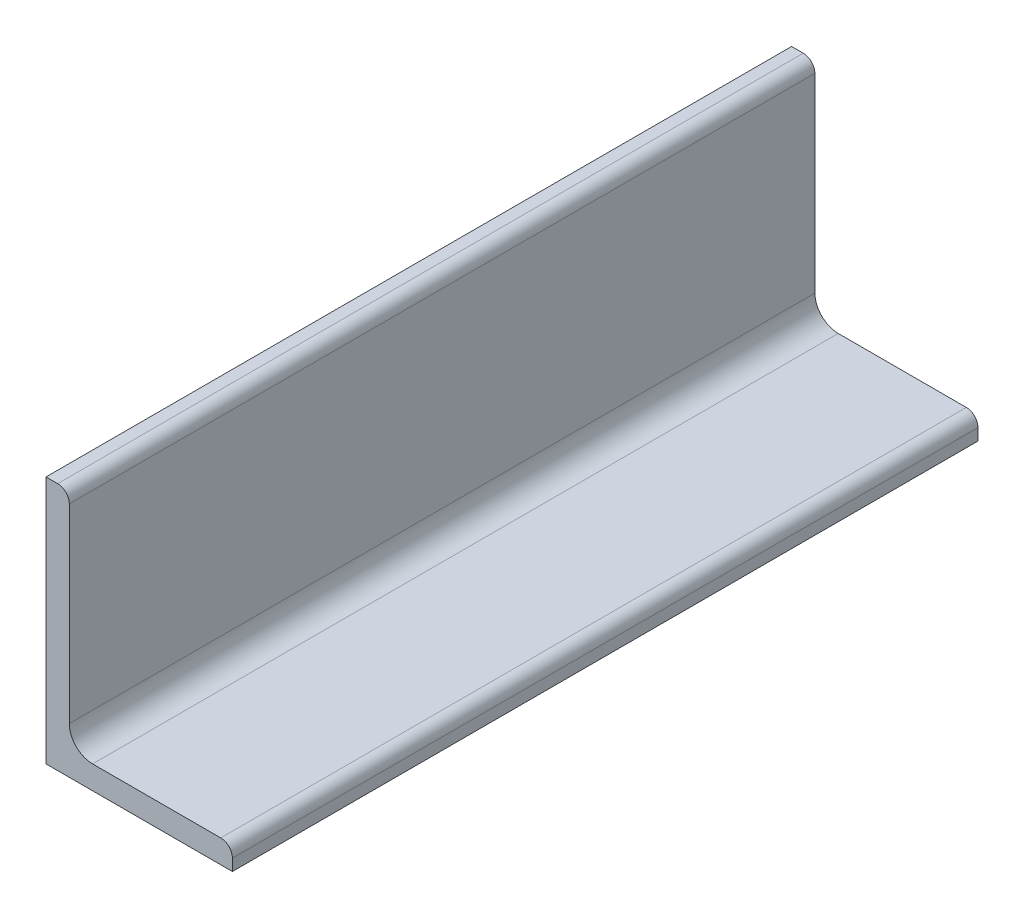
ISO-10303-21;
HEADER;
FILE_DESCRIPTION(('STEP AP214'),'2;1');
FILE_NAME('part.step','',(''),(''),'','','');
FILE_SCHEMA(('AUTOMOTIVE_DESIGN { 1 0 10303 214 1 1 1 1 }'));
ENDSEC;
DATA;
#1=APPLICATION_CONTEXT('core data for automotive mechanical design processes');
#2=APPLICATION_PROTOCOL_DEFINITION('international standard','automotive_design',2000,#1);
#3=PRODUCT_CONTEXT('',#1,'mechanical');
#4=PRODUCT('Part','Part','',(#3));
#5=PRODUCT_RELATED_PRODUCT_CATEGORY('part','',(#4));
#6=PRODUCT_DEFINITION_FORMATION('','',#4);
#7=PRODUCT_DEFINITION_CONTEXT('part definition',#1,'design');
#8=PRODUCT_DEFINITION('design','',#6,#7);
#9=PRODUCT_DEFINITION_SHAPE('','',#8);
#10=(LENGTH_UNIT() NAMED_UNIT(*) SI_UNIT(.MILLI.,.METRE.));
#11=(NAMED_UNIT(*) PLANE_ANGLE_UNIT() SI_UNIT($,.RADIAN.));
#12=(NAMED_UNIT(*) SI_UNIT($,.STERADIAN.) SOLID_ANGLE_UNIT());
#13=UNCERTAINTY_MEASURE_WITH_UNIT(LENGTH_MEASURE(1.E-05),#10,'distance_accuracy_value','');
#14=(GEOMETRIC_REPRESENTATION_CONTEXT(3) GLOBAL_UNCERTAINTY_ASSIGNED_CONTEXT((#13)) GLOBAL_UNIT_ASSIGNED_CONTEXT((#10,
#11,#12)) REPRESENTATION_CONTEXT('',''));
#15=CARTESIAN_POINT('',(0.,0.,0.));
#16=DIRECTION('',(0.,0.,1.));
#17=DIRECTION('',(1.,0.,0.));
#18=AXIS2_PLACEMENT_3D('',#15,#16,#17);
#19=CARTESIAN_POINT('',(0.490776827053332,102.172018782971,304.8));
#20=DIRECTION('',(1.,0.,0.));
#21=DIRECTION('',(0.,0.,-1.));
#22=AXIS2_PLACEMENT_3D('',#19,#20,#21);
#23=PLANE('',#22);
#24=DIRECTION('',(0.,-1.,0.));
#25=VECTOR('',#24,1.);
#26=CARTESIAN_POINT('',(0.490776827053332,102.172018782971,0.));
#27=LINE('',#26,#25);
#28=CARTESIAN_POINT('',(0.490776827053332,102.172018782971,0.));
#29=VERTEX_POINT('',#28);
#30=CARTESIAN_POINT('',(0.490776827053332,0.572018782971054,0.));
#31=VERTEX_POINT('',#30);
#32=EDGE_CURVE('E135',#29,#31,#27,.T.);
#33=ORIENTED_EDGE('',*,*,#32,.T.);
#34=DIRECTION('',(0.,0.,-1.));
#35=VECTOR('',#34,1.);
#36=CARTESIAN_POINT('',(0.490776827053332,0.572018782971054,304.8));
#37=LINE('',#36,#35);
#38=CARTESIAN_POINT('',(0.490776827053332,0.572018782971054,304.8));
#39=VERTEX_POINT('',#38);
#40=EDGE_CURVE('E11',#39,#31,#37,.T.);
#41=ORIENTED_EDGE('',*,*,#40,.F.);
#42=DIRECTION('',(0.,-1.,0.));
#43=VECTOR('',#42,1.);
#44=CARTESIAN_POINT('',(0.490776827053332,102.172018782971,304.8));
#45=LINE('',#44,#43);
#46=CARTESIAN_POINT('',(0.490776827053332,102.172018782971,304.8));
#47=VERTEX_POINT('',#46);
#48=EDGE_CURVE('E151',#47,#39,#45,.T.);
#49=ORIENTED_EDGE('',*,*,#48,.F.);
#50=DIRECTION('',(0.,0.,-1.));
#51=VECTOR('',#50,1.);
#52=CARTESIAN_POINT('',(0.490776827053332,102.172018782971,304.8));
#53=LINE('',#52,#51);
#54=EDGE_CURVE('E131',#47,#29,#53,.T.);
#55=ORIENTED_EDGE('',*,*,#54,.T.);
#56=EDGE_LOOP('',(#33,#41,#49,#55));
#57=FACE_BOUND('',#56,.T.);
#58=ADVANCED_FACE('F33',(#57),#23,.F.);
#59=CARTESIAN_POINT('',(0.490776827053332,0.572018782971054,304.8));
#60=DIRECTION('',(0.,1.,0.));
#61=DIRECTION('',(0.,0.,1.));
#62=AXIS2_PLACEMENT_3D('',#59,#60,#61);
#63=PLANE('',#62);
#64=DIRECTION('',(1.,0.,0.));
#65=VECTOR('',#64,1.);
#66=CARTESIAN_POINT('',(0.490776827053332,0.572018782971054,0.));
#67=LINE('',#66,#65);
#68=CARTESIAN_POINT('',(76.6907768270533,0.572018782971054,0.));
#69=VERTEX_POINT('',#68);
#70=EDGE_CURVE('E138',#31,#69,#67,.T.);
#71=ORIENTED_EDGE('',*,*,#70,.T.);
#72=DIRECTION('',(0.,0.,-1.));
#73=VECTOR('',#72,1.);
#74=CARTESIAN_POINT('',(76.6907768270533,0.572018782971054,304.8));
#75=LINE('',#74,#73);
#76=CARTESIAN_POINT('',(76.6907768270533,0.572018782971054,304.8));
#77=VERTEX_POINT('',#76);
#78=EDGE_CURVE('E41',#77,#69,#75,.T.);
#79=ORIENTED_EDGE('',*,*,#78,.F.);
#80=DIRECTION('',(1.,0.,0.));
#81=VECTOR('',#80,1.);
#82=CARTESIAN_POINT('',(0.490776827053332,0.572018782971054,304.8));
#83=LINE('',#82,#81);
#84=EDGE_CURVE('E95',#39,#77,#83,.T.);
#85=ORIENTED_EDGE('',*,*,#84,.F.);
#86=ORIENTED_EDGE('',*,*,#40,.T.);
#87=EDGE_LOOP('',(#71,#79,#85,#86));
#88=FACE_BOUND('',#87,.T.);
#89=ADVANCED_FACE('F194',(#88),#63,.F.);
#90=CARTESIAN_POINT('',(76.6907768270533,0.572018782971054,304.8));
#91=DIRECTION('',(-1.,0.,0.));
#92=DIRECTION('',(0.,0.,1.));
#93=AXIS2_PLACEMENT_3D('',#90,#91,#92);
#94=PLANE('',#93);
#95=DIRECTION('',(0.,1.,0.));
#96=VECTOR('',#95,1.);
#97=CARTESIAN_POINT('',(76.6907768270533,0.572018782971054,0.));
#98=LINE('',#97,#96);
#99=CARTESIAN_POINT('',(76.6907768270533,5.33451878297105,0.));
#100=VERTEX_POINT('',#99);
#101=EDGE_CURVE('E140',#69,#100,#98,.T.);
#102=ORIENTED_EDGE('',*,*,#101,.T.);
#103=DIRECTION('',(0.,0.,-1.));
#104=VECTOR('',#103,1.);
#105=CARTESIAN_POINT('',(76.6907768270533,5.33451878297105,304.8));
#106=LINE('',#105,#104);
#107=CARTESIAN_POINT('',(76.6907768270533,5.33451878297105,304.8));
#108=VERTEX_POINT('',#107);
#109=EDGE_CURVE('E161',#108,#100,#106,.T.);
#110=ORIENTED_EDGE('',*,*,#109,.F.);
#111=DIRECTION('',(0.,1.,0.));
#112=VECTOR('',#111,1.);
#113=CARTESIAN_POINT('',(76.6907768270533,0.572018782971054,304.8));
#114=LINE('',#113,#112);
#115=EDGE_CURVE('E169',#77,#108,#114,.T.);
#116=ORIENTED_EDGE('',*,*,#115,.F.);
#117=ORIENTED_EDGE('',*,*,#78,.T.);
#118=EDGE_LOOP('',(#102,#110,#116,#117));
#119=FACE_BOUND('',#118,.T.);
#120=ADVANCED_FACE('F167',(#119),#94,.F.);
#121=CARTESIAN_POINT('',(71.9282768270533,5.33451878297105,304.8));
#122=DIRECTION('',(0.,0.,-1.));
#123=DIRECTION('',(-1.,0.,0.));
#124=AXIS2_PLACEMENT_3D('',#121,#122,#123);
#125=CYLINDRICAL_SURFACE('',#124,4.7625);
#126=CARTESIAN_POINT('',(71.9282768270533,5.33451878297105,0.));
#127=DIRECTION('',(0.,0.,1.));
#128=DIRECTION('',(1.,0.,0.));
#129=AXIS2_PLACEMENT_3D('',#126,#127,#128);
#130=CIRCLE('',#129,4.7625);
#131=CARTESIAN_POINT('',(71.9282768270533,10.0970187829711,0.));
#132=VERTEX_POINT('',#131);
#133=EDGE_CURVE('E142',#100,#132,#130,.T.);
#134=ORIENTED_EDGE('',*,*,#133,.T.);
#135=DIRECTION('',(0.,0.,-1.));
#136=VECTOR('',#135,1.);
#137=CARTESIAN_POINT('',(71.9282768270533,10.0970187829711,304.8));
#138=LINE('',#137,#136);
#139=CARTESIAN_POINT('',(71.9282768270533,10.0970187829711,304.8));
#140=VERTEX_POINT('',#139);
#141=EDGE_CURVE('E158',#140,#132,#138,.T.);
#142=ORIENTED_EDGE('',*,*,#141,.F.);
#143=CARTESIAN_POINT('',(71.9282768270533,5.33451878297105,304.8));
#144=DIRECTION('',(0.,0.,1.));
#145=DIRECTION('',(1.,0.,0.));
#146=AXIS2_PLACEMENT_3D('',#143,#144,#145);
#147=CIRCLE('',#146,4.7625);
#148=EDGE_CURVE('E185',#108,#140,#147,.T.);
#149=ORIENTED_EDGE('',*,*,#148,.F.);
#150=ORIENTED_EDGE('',*,*,#109,.T.);
#151=EDGE_LOOP('',(#134,#142,#149,#150));
#152=FACE_BOUND('',#151,.T.);
#153=ADVANCED_FACE('F178',(#152),#125,.T.);
#154=CARTESIAN_POINT('',(71.9282768270533,10.0970187829711,304.8));
#155=DIRECTION('',(0.,-1.,0.));
#156=DIRECTION('',(0.,0.,-1.));
#157=AXIS2_PLACEMENT_3D('',#154,#155,#156);
#158=PLANE('',#157);
#159=DIRECTION('',(-1.,0.,0.));
#160=VECTOR('',#159,1.);
#161=CARTESIAN_POINT('',(71.9282768270533,10.0970187829711,0.));
#162=LINE('',#161,#160);
#163=CARTESIAN_POINT('',(19.5407768270533,10.0970187829711,0.));
#164=VERTEX_POINT('',#163);
#165=EDGE_CURVE('E144',#132,#164,#162,.T.);
#166=ORIENTED_EDGE('',*,*,#165,.T.);
#167=DIRECTION('',(0.,0.,-1.));
#168=VECTOR('',#167,1.);
#169=CARTESIAN_POINT('',(19.5407768270533,10.0970187829711,304.8));
#170=LINE('',#169,#168);
#171=CARTESIAN_POINT('',(19.5407768270533,10.0970187829711,304.8));
#172=VERTEX_POINT('',#171);
#173=EDGE_CURVE('E155',#172,#164,#170,.T.);
#174=ORIENTED_EDGE('',*,*,#173,.F.);
#175=DIRECTION('',(-1.,0.,0.));
#176=VECTOR('',#175,1.);
#177=CARTESIAN_POINT('',(71.9282768270533,10.0970187829711,304.8));
#178=LINE('',#177,#176);
#179=EDGE_CURVE('E184',#140,#172,#178,.T.);
#180=ORIENTED_EDGE('',*,*,#179,.F.);
#181=ORIENTED_EDGE('',*,*,#141,.T.);
#182=EDGE_LOOP('',(#166,#174,#180,#181));
#183=FACE_BOUND('',#182,.T.);
#184=ADVANCED_FACE('F182',(#183),#158,.F.);
#185=CARTESIAN_POINT('',(19.5407768270533,19.622018782971,304.8));
#186=DIRECTION('',(0.,0.,-1.));
#187=DIRECTION('',(-1.,0.,0.));
#188=AXIS2_PLACEMENT_3D('',#185,#186,#187);
#189=CYLINDRICAL_SURFACE('',#188,9.52499999999999);
#190=CARTESIAN_POINT('',(19.5407768270533,19.622018782971,0.));
#191=DIRECTION('',(0.,0.,-1.));
#192=DIRECTION('',(1.,0.,0.));
#193=AXIS2_PLACEMENT_3D('',#190,#191,#192);
#194=CIRCLE('',#193,9.52499999999999);
#195=CARTESIAN_POINT('',(10.0157768270533,19.6220187829711,0.));
#196=VERTEX_POINT('',#195);
#197=EDGE_CURVE('E146',#164,#196,#194,.T.);
#198=ORIENTED_EDGE('',*,*,#197,.T.);
#199=DIRECTION('',(0.,0.,-1.));
#200=VECTOR('',#199,1.);
#201=CARTESIAN_POINT('',(10.0157768270533,19.6220187829711,304.8));
#202=LINE('',#201,#200);
#203=CARTESIAN_POINT('',(10.0157768270533,19.6220187829711,304.8));
#204=VERTEX_POINT('',#203);
#205=EDGE_CURVE('E126',#204,#196,#202,.T.);
#206=ORIENTED_EDGE('',*,*,#205,.F.);
#207=CARTESIAN_POINT('',(19.5407768270533,19.622018782971,304.8));
#208=DIRECTION('',(0.,0.,-1.));
#209=DIRECTION('',(1.,0.,0.));
#210=AXIS2_PLACEMENT_3D('',#207,#208,#209);
#211=CIRCLE('',#210,9.52499999999999);
#212=EDGE_CURVE('E117',#172,#204,#211,.T.);
#213=ORIENTED_EDGE('',*,*,#212,.F.);
#214=ORIENTED_EDGE('',*,*,#173,.T.);
#215=EDGE_LOOP('',(#198,#206,#213,#214));
#216=FACE_BOUND('',#215,.T.);
#217=ADVANCED_FACE('F206',(#216),#189,.F.);
#218=CARTESIAN_POINT('',(10.0157768270533,19.6220187829711,304.8));
#219=DIRECTION('',(-1.,0.,0.));
#220=DIRECTION('',(0.,0.,1.));
#221=AXIS2_PLACEMENT_3D('',#218,#219,#220);
#222=PLANE('',#221);
#223=DIRECTION('',(0.,1.,0.));
#224=VECTOR('',#223,1.);
#225=CARTESIAN_POINT('',(10.0157768270533,19.6220187829711,0.));
#226=LINE('',#225,#224);
#227=CARTESIAN_POINT('',(10.0157768270533,97.409518782971,0.));
#228=VERTEX_POINT('',#227);
#229=EDGE_CURVE('E125',#196,#228,#226,.T.);
#230=ORIENTED_EDGE('',*,*,#229,.T.);
#231=DIRECTION('',(0.,0.,-1.));
#232=VECTOR('',#231,1.);
#233=CARTESIAN_POINT('',(10.0157768270533,97.409518782971,304.8));
#234=LINE('',#233,#232);
#235=CARTESIAN_POINT('',(10.0157768270533,97.409518782971,304.8));
#236=VERTEX_POINT('',#235);
#237=EDGE_CURVE('E122',#236,#228,#234,.T.);
#238=ORIENTED_EDGE('',*,*,#237,.F.);
#239=DIRECTION('',(0.,1.,0.));
#240=VECTOR('',#239,1.);
#241=CARTESIAN_POINT('',(10.0157768270533,19.6220187829711,304.8));
#242=LINE('',#241,#240);
#243=EDGE_CURVE('E111',#204,#236,#242,.T.);
#244=ORIENTED_EDGE('',*,*,#243,.F.);
#245=ORIENTED_EDGE('',*,*,#205,.T.);
#246=EDGE_LOOP('',(#230,#238,#244,#245));
#247=FACE_BOUND('',#246,.T.);
#248=ADVANCED_FACE('F123',(#247),#222,.F.);
#249=CARTESIAN_POINT('',(5.25327682705333,97.409518782971,304.8));
#250=DIRECTION('',(0.,0.,-1.));
#251=DIRECTION('',(-1.,0.,0.));
#252=AXIS2_PLACEMENT_3D('',#249,#250,#251);
#253=CYLINDRICAL_SURFACE('',#252,4.7625);
#254=CARTESIAN_POINT('',(5.25327682705333,97.409518782971,0.));
#255=DIRECTION('',(0.,0.,1.));
#256=DIRECTION('',(1.,0.,0.));
#257=AXIS2_PLACEMENT_3D('',#254,#255,#256);
#258=CIRCLE('',#257,4.7625);
#259=CARTESIAN_POINT('',(5.25327682705333,102.172018782971,0.));
#260=VERTEX_POINT('',#259);
#261=EDGE_CURVE('E81',#228,#260,#258,.T.);
#262=ORIENTED_EDGE('',*,*,#261,.T.);
#263=DIRECTION('',(0.,0.,-1.));
#264=VECTOR('',#263,1.);
#265=CARTESIAN_POINT('',(5.25327682705333,102.172018782971,304.8));
#266=LINE('',#265,#264);
#267=CARTESIAN_POINT('',(5.25327682705333,102.172018782971,304.8));
#268=VERTEX_POINT('',#267);
#269=EDGE_CURVE('E127',#268,#260,#266,.T.);
#270=ORIENTED_EDGE('',*,*,#269,.F.);
#271=CARTESIAN_POINT('',(5.25327682705333,97.409518782971,304.8));
#272=DIRECTION('',(0.,0.,1.));
#273=DIRECTION('',(1.,0.,0.));
#274=AXIS2_PLACEMENT_3D('',#271,#272,#273);
#275=CIRCLE('',#274,4.7625);
#276=EDGE_CURVE('E115',#236,#268,#275,.T.);
#277=ORIENTED_EDGE('',*,*,#276,.F.);
#278=ORIENTED_EDGE('',*,*,#237,.T.);
#279=EDGE_LOOP('',(#262,#270,#277,#278));
#280=FACE_BOUND('',#279,.T.);
#281=ADVANCED_FACE('F129',(#280),#253,.T.);
#282=CARTESIAN_POINT('',(5.25327682705333,102.172018782971,304.8));
#283=DIRECTION('',(0.,-1.,0.));
#284=DIRECTION('',(0.,0.,-1.));
#285=AXIS2_PLACEMENT_3D('',#282,#283,#284);
#286=PLANE('',#285);
#287=DIRECTION('',(-1.,0.,0.));
#288=VECTOR('',#287,1.);
#289=CARTESIAN_POINT('',(5.25327682705333,102.172018782971,0.));
#290=LINE('',#289,#288);
#291=EDGE_CURVE('E87',#260,#29,#290,.T.);
#292=ORIENTED_EDGE('',*,*,#291,.T.);
#293=ORIENTED_EDGE('',*,*,#54,.F.);
#294=DIRECTION('',(-1.,0.,0.));
#295=VECTOR('',#294,1.);
#296=CARTESIAN_POINT('',(5.25327682705333,102.172018782971,304.8));
#297=LINE('',#296,#295);
#298=EDGE_CURVE('E49',#268,#47,#297,.T.);
#299=ORIENTED_EDGE('',*,*,#298,.F.);
#300=ORIENTED_EDGE('',*,*,#269,.T.);
#301=EDGE_LOOP('',(#292,#293,#299,#300));
#302=FACE_BOUND('',#301,.T.);
#303=ADVANCED_FACE('F214',(#302),#286,.F.);
#304=CARTESIAN_POINT('',(71.9282768270533,5.33451878297105,304.8));
#305=DIRECTION('',(0.,0.,1.));
#306=DIRECTION('',(1.,0.,0.));
#307=AXIS2_PLACEMENT_3D('',#304,#305,#306);
#308=PLANE('',#307);
#309=ORIENTED_EDGE('',*,*,#48,.T.);
#310=ORIENTED_EDGE('',*,*,#84,.T.);
#311=ORIENTED_EDGE('',*,*,#115,.T.);
#312=ORIENTED_EDGE('',*,*,#148,.T.);
#313=ORIENTED_EDGE('',*,*,#179,.T.);
#314=ORIENTED_EDGE('',*,*,#212,.T.);
#315=ORIENTED_EDGE('',*,*,#243,.T.);
#316=ORIENTED_EDGE('',*,*,#276,.T.);
#317=ORIENTED_EDGE('',*,*,#298,.T.);
#318=EDGE_LOOP('',(#309,#310,#311,#312,#313,#314,#315,#316,#317));
#319=FACE_BOUND('',#318,.T.);
#320=ADVANCED_FACE('F113',(#319),#308,.T.);
#321=CARTESIAN_POINT('',(71.9282768270533,5.33451878297105,0.));
#322=DIRECTION('',(0.,0.,1.));
#323=DIRECTION('',(1.,0.,0.));
#324=AXIS2_PLACEMENT_3D('',#321,#322,#323);
#325=PLANE('',#324);
#326=ORIENTED_EDGE('',*,*,#32,.F.);
#327=ORIENTED_EDGE('',*,*,#291,.F.);
#328=ORIENTED_EDGE('',*,*,#261,.F.);
#329=ORIENTED_EDGE('',*,*,#229,.F.);
#330=ORIENTED_EDGE('',*,*,#197,.F.);
#331=ORIENTED_EDGE('',*,*,#165,.F.);
#332=ORIENTED_EDGE('',*,*,#133,.F.);
#333=ORIENTED_EDGE('',*,*,#101,.F.);
#334=ORIENTED_EDGE('',*,*,#70,.F.);
#335=EDGE_LOOP('',(#326,#327,#328,#329,#330,#331,#332,#333,#334));
#336=FACE_BOUND('',#335,.T.);
#337=ADVANCED_FACE('F173',(#336),#325,.F.);
#338=CLOSED_SHELL('',(#58,#89,#120,#153,#184,#217,#248,#281,#303,#320,#337));
#339=MANIFOLD_SOLID_BREP('B2',#338);
#340=ADVANCED_BREP_SHAPE_REPRESENTATION('',(#18,#339),#14);
#341=SHAPE_DEFINITION_REPRESENTATION(#9,#340);
ENDSEC;
END-ISO-10303-21;
